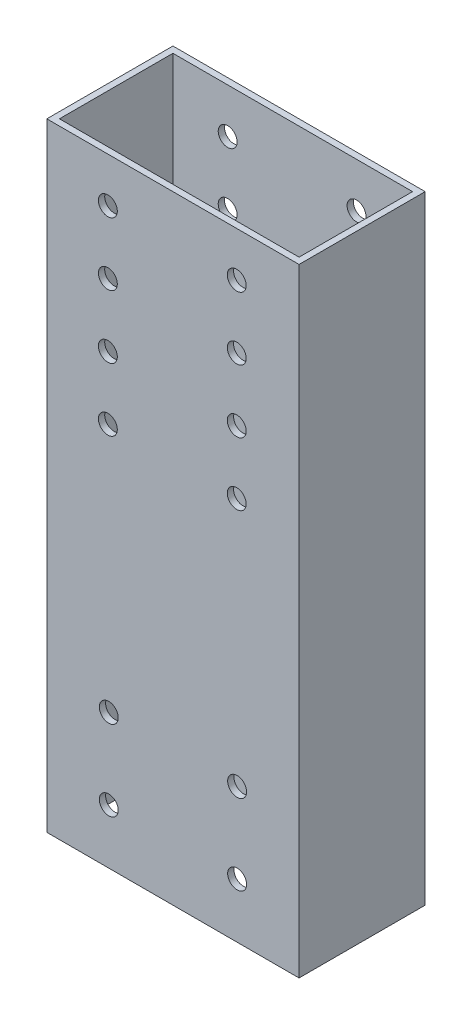
ISO-10303-21;
HEADER;
FILE_DESCRIPTION(('STEP AP214'),'2;1');
FILE_NAME('part.step','',(''),(''),'','','');
FILE_SCHEMA(('AUTOMOTIVE_DESIGN { 1 0 10303 214 1 1 1 1 }'));
ENDSEC;
DATA;
#1=APPLICATION_CONTEXT('core data for automotive mechanical design processes');
#2=APPLICATION_PROTOCOL_DEFINITION('international standard','automotive_design',2000,#1);
#3=PRODUCT_CONTEXT('',#1,'mechanical');
#4=PRODUCT('Part','Part','',(#3));
#5=PRODUCT_RELATED_PRODUCT_CATEGORY('part','',(#4));
#6=PRODUCT_DEFINITION_FORMATION('','',#4);
#7=PRODUCT_DEFINITION_CONTEXT('part definition',#1,'design');
#8=PRODUCT_DEFINITION('design','',#6,#7);
#9=PRODUCT_DEFINITION_SHAPE('','',#8);
#10=(LENGTH_UNIT() NAMED_UNIT(*) SI_UNIT(.MILLI.,.METRE.));
#11=(NAMED_UNIT(*) PLANE_ANGLE_UNIT() SI_UNIT($,.RADIAN.));
#12=(NAMED_UNIT(*) SI_UNIT($,.STERADIAN.) SOLID_ANGLE_UNIT());
#13=UNCERTAINTY_MEASURE_WITH_UNIT(LENGTH_MEASURE(1.E-05),#10,'distance_accuracy_value','');
#14=(GEOMETRIC_REPRESENTATION_CONTEXT(3) GLOBAL_UNCERTAINTY_ASSIGNED_CONTEXT((#13)) GLOBAL_UNIT_ASSIGNED_CONTEXT((#10,
#11,#12)) REPRESENTATION_CONTEXT('',''));
#15=CARTESIAN_POINT('',(0.,0.,0.));
#16=DIRECTION('',(0.,0.,1.));
#17=DIRECTION('',(1.,0.,0.));
#18=AXIS2_PLACEMENT_3D('',#15,#16,#17);
#19=CARTESIAN_POINT('',(0.,98.0000000000001,0.));
#20=DIRECTION('',(0.,-1.,0.));
#21=DIRECTION('',(0.,0.,-1.));
#22=AXIS2_PLACEMENT_3D('',#19,#20,#21);
#23=PLANE('',#22);
#24=DIRECTION('',(0.,0.,-1.));
#25=VECTOR('',#24,1.);
#26=CARTESIAN_POINT('',(20.,98.0000000000001,10.));
#27=LINE('',#26,#25);
#28=CARTESIAN_POINT('',(20.,98.0000000000001,10.));
#29=VERTEX_POINT('',#28);
#30=CARTESIAN_POINT('',(20.,98.0000000000001,-10.));
#31=VERTEX_POINT('',#30);
#32=EDGE_CURVE('E143',#29,#31,#27,.T.);
#33=ORIENTED_EDGE('',*,*,#32,.T.);
#34=DIRECTION('',(-1.,0.,0.));
#35=VECTOR('',#34,1.);
#36=CARTESIAN_POINT('',(-20.,98.0000000000001,-10.));
#37=LINE('',#36,#35);
#38=CARTESIAN_POINT('',(-20.,98.0000000000001,-10.));
#39=VERTEX_POINT('',#38);
#40=EDGE_CURVE('E146',#31,#39,#37,.T.);
#41=ORIENTED_EDGE('',*,*,#40,.T.);
#42=DIRECTION('',(0.,0.,1.));
#43=VECTOR('',#42,1.);
#44=CARTESIAN_POINT('',(-20.,98.0000000000001,10.));
#45=LINE('',#44,#43);
#46=CARTESIAN_POINT('',(-20.,98.0000000000001,10.));
#47=VERTEX_POINT('',#46);
#48=EDGE_CURVE('E149',#39,#47,#45,.T.);
#49=ORIENTED_EDGE('',*,*,#48,.T.);
#50=DIRECTION('',(1.,0.,0.));
#51=VECTOR('',#50,1.);
#52=CARTESIAN_POINT('',(-20.,98.0000000000001,10.));
#53=LINE('',#52,#51);
#54=EDGE_CURVE('E151',#47,#29,#53,.T.);
#55=ORIENTED_EDGE('',*,*,#54,.T.);
#56=EDGE_LOOP('',(#33,#41,#49,#55));
#57=FACE_BOUND('',#56,.T.);
#58=DIRECTION('',(0.,0.,-1.));
#59=VECTOR('',#58,1.);
#60=CARTESIAN_POINT('',(19.,98.0000000000001,0.));
#61=LINE('',#60,#59);
#62=CARTESIAN_POINT('',(19.,98.0000000000001,9.));
#63=VERTEX_POINT('',#62);
#64=CARTESIAN_POINT('',(19.,98.0000000000001,-9.));
#65=VERTEX_POINT('',#64);
#66=EDGE_CURVE('E131',#63,#65,#61,.T.);
#67=ORIENTED_EDGE('',*,*,#66,.F.);
#68=DIRECTION('',(1.,0.,0.));
#69=VECTOR('',#68,1.);
#70=CARTESIAN_POINT('',(0.,98.0000000000001,9.));
#71=LINE('',#70,#69);
#72=CARTESIAN_POINT('',(-19.,98.0000000000001,9.));
#73=VERTEX_POINT('',#72);
#74=EDGE_CURVE('E115',#73,#63,#71,.T.);
#75=ORIENTED_EDGE('',*,*,#74,.F.);
#76=DIRECTION('',(0.,0.,1.));
#77=VECTOR('',#76,1.);
#78=CARTESIAN_POINT('',(-19.,98.0000000000001,0.));
#79=LINE('',#78,#77);
#80=CARTESIAN_POINT('',(-19.,98.0000000000001,-9.));
#81=VERTEX_POINT('',#80);
#82=EDGE_CURVE('E140',#81,#73,#79,.T.);
#83=ORIENTED_EDGE('',*,*,#82,.F.);
#84=DIRECTION('',(-1.,0.,0.));
#85=VECTOR('',#84,1.);
#86=CARTESIAN_POINT('',(0.,98.0000000000001,-9.));
#87=LINE('',#86,#85);
#88=EDGE_CURVE('E133',#65,#81,#87,.T.);
#89=ORIENTED_EDGE('',*,*,#88,.F.);
#90=EDGE_LOOP('',(#67,#75,#83,#89));
#91=FACE_BOUND('',#90,.T.);
#92=ADVANCED_FACE('F43',(#57,#91),#23,.F.);
#93=CARTESIAN_POINT('',(0.,0.,0.));
#94=DIRECTION('',(0.,-1.,0.));
#95=DIRECTION('',(0.,0.,-1.));
#96=AXIS2_PLACEMENT_3D('',#93,#94,#95);
#97=PLANE('',#96);
#98=DIRECTION('',(0.,0.,-1.));
#99=VECTOR('',#98,1.);
#100=CARTESIAN_POINT('',(20.,0.,10.));
#101=LINE('',#100,#99);
#102=CARTESIAN_POINT('',(20.,0.,10.));
#103=VERTEX_POINT('',#102);
#104=CARTESIAN_POINT('',(20.,0.,-10.));
#105=VERTEX_POINT('',#104);
#106=EDGE_CURVE('E154',#103,#105,#101,.T.);
#107=ORIENTED_EDGE('',*,*,#106,.F.);
#108=DIRECTION('',(1.,0.,0.));
#109=VECTOR('',#108,1.);
#110=CARTESIAN_POINT('',(-20.,0.,10.));
#111=LINE('',#110,#109);
#112=CARTESIAN_POINT('',(-20.,0.,10.));
#113=VERTEX_POINT('',#112);
#114=EDGE_CURVE('E147',#113,#103,#111,.T.);
#115=ORIENTED_EDGE('',*,*,#114,.F.);
#116=DIRECTION('',(0.,0.,1.));
#117=VECTOR('',#116,1.);
#118=CARTESIAN_POINT('',(-20.,0.,10.));
#119=LINE('',#118,#117);
#120=CARTESIAN_POINT('',(-20.,0.,-10.));
#121=VERTEX_POINT('',#120);
#122=EDGE_CURVE('E159',#121,#113,#119,.T.);
#123=ORIENTED_EDGE('',*,*,#122,.F.);
#124=DIRECTION('',(-1.,0.,0.));
#125=VECTOR('',#124,1.);
#126=CARTESIAN_POINT('',(-20.,0.,-10.));
#127=LINE('',#126,#125);
#128=EDGE_CURVE('E157',#105,#121,#127,.T.);
#129=ORIENTED_EDGE('',*,*,#128,.F.);
#130=EDGE_LOOP('',(#107,#115,#123,#129));
#131=FACE_BOUND('',#130,.T.);
#132=DIRECTION('',(1.,0.,0.));
#133=VECTOR('',#132,1.);
#134=CARTESIAN_POINT('',(0.,0.,9.));
#135=LINE('',#134,#133);
#136=CARTESIAN_POINT('',(-19.,0.,9.));
#137=VERTEX_POINT('',#136);
#138=CARTESIAN_POINT('',(19.,0.,9.));
#139=VERTEX_POINT('',#138);
#140=EDGE_CURVE('E113',#137,#139,#135,.T.);
#141=ORIENTED_EDGE('',*,*,#140,.T.);
#142=DIRECTION('',(0.,0.,-1.));
#143=VECTOR('',#142,1.);
#144=CARTESIAN_POINT('',(19.,0.,0.));
#145=LINE('',#144,#143);
#146=CARTESIAN_POINT('',(19.,0.,-9.));
#147=VERTEX_POINT('',#146);
#148=EDGE_CURVE('E121',#139,#147,#145,.T.);
#149=ORIENTED_EDGE('',*,*,#148,.T.);
#150=DIRECTION('',(-1.,0.,0.));
#151=VECTOR('',#150,1.);
#152=CARTESIAN_POINT('',(0.,0.,-9.));
#153=LINE('',#152,#151);
#154=CARTESIAN_POINT('',(-19.,0.,-9.));
#155=VERTEX_POINT('',#154);
#156=EDGE_CURVE('E127',#147,#155,#153,.T.);
#157=ORIENTED_EDGE('',*,*,#156,.T.);
#158=DIRECTION('',(0.,0.,1.));
#159=VECTOR('',#158,1.);
#160=CARTESIAN_POINT('',(-19.,0.,0.));
#161=LINE('',#160,#159);
#162=EDGE_CURVE('E67',#155,#137,#161,.T.);
#163=ORIENTED_EDGE('',*,*,#162,.T.);
#164=EDGE_LOOP('',(#141,#149,#157,#163));
#165=FACE_BOUND('',#164,.T.);
#166=ADVANCED_FACE('F130',(#131,#165),#97,.T.);
#167=CARTESIAN_POINT('',(20.,98.0000000000001,10.));
#168=DIRECTION('',(-1.,0.,0.));
#169=DIRECTION('',(0.,0.,1.));
#170=AXIS2_PLACEMENT_3D('',#167,#168,#169);
#171=PLANE('',#170);
#172=ORIENTED_EDGE('',*,*,#106,.T.);
#173=DIRECTION('',(0.,-1.,0.));
#174=VECTOR('',#173,1.);
#175=CARTESIAN_POINT('',(20.,98.0000000000001,-10.));
#176=LINE('',#175,#174);
#177=EDGE_CURVE('E11',#31,#105,#176,.T.);
#178=ORIENTED_EDGE('',*,*,#177,.F.);
#179=ORIENTED_EDGE('',*,*,#32,.F.);
#180=DIRECTION('',(0.,-1.,0.));
#181=VECTOR('',#180,1.);
#182=CARTESIAN_POINT('',(20.,98.0000000000001,10.));
#183=LINE('',#182,#181);
#184=EDGE_CURVE('E153',#29,#103,#183,.T.);
#185=ORIENTED_EDGE('',*,*,#184,.T.);
#186=EDGE_LOOP('',(#172,#178,#179,#185));
#187=FACE_BOUND('',#186,.T.);
#188=ADVANCED_FACE('F45',(#187),#171,.F.);
#189=CARTESIAN_POINT('',(-20.,98.0000000000001,-10.));
#190=DIRECTION('',(0.,0.,1.));
#191=DIRECTION('',(1.,0.,0.));
#192=AXIS2_PLACEMENT_3D('',#189,#190,#191);
#193=PLANE('',#192);
#194=CARTESIAN_POINT('',(10.116242575959,60.8998336255279,-10.));
#195=DIRECTION('',(0.,0.,-1.));
#196=DIRECTION('',(-1.,0.,0.));
#197=AXIS2_PLACEMENT_3D('',#194,#195,#196);
#198=CIRCLE('',#197,1.5);
#199=CARTESIAN_POINT('',(8.61624257595895,60.8998336255279,-10.));
#200=VERTEX_POINT('',#199);
#201=EDGE_CURVE('E318',#200,#200,#198,.T.);
#202=ORIENTED_EDGE('',*,*,#201,.F.);
#203=EDGE_LOOP('',(#202));
#204=FACE_BOUND('',#203,.T.);
#205=CARTESIAN_POINT('',(10.116242575959,70.8998336255278,-10.));
#206=DIRECTION('',(0.,0.,-1.));
#207=DIRECTION('',(-1.,0.,0.));
#208=AXIS2_PLACEMENT_3D('',#205,#206,#207);
#209=CIRCLE('',#208,1.5);
#210=CARTESIAN_POINT('',(8.61624257595895,70.8998336255278,-10.));
#211=VERTEX_POINT('',#210);
#212=EDGE_CURVE('E322',#211,#211,#209,.T.);
#213=ORIENTED_EDGE('',*,*,#212,.F.);
#214=EDGE_LOOP('',(#213));
#215=FACE_BOUND('',#214,.T.);
#216=CARTESIAN_POINT('',(-10.3212201594344,70.8998336255278,-10.));
#217=DIRECTION('',(0.,0.,-1.));
#218=DIRECTION('',(-1.,0.,0.));
#219=AXIS2_PLACEMENT_3D('',#216,#217,#218);
#220=CIRCLE('',#219,1.50000000000001);
#221=CARTESIAN_POINT('',(-11.8212201594344,70.8998336255278,-10.));
#222=VERTEX_POINT('',#221);
#223=EDGE_CURVE('E326',#222,#222,#220,.T.);
#224=ORIENTED_EDGE('',*,*,#223,.F.);
#225=EDGE_LOOP('',(#224));
#226=FACE_BOUND('',#225,.T.);
#227=CARTESIAN_POINT('',(-10.3212201594344,80.8998336255279,-10.));
#228=DIRECTION('',(0.,0.,-1.));
#229=DIRECTION('',(-1.,0.,0.));
#230=AXIS2_PLACEMENT_3D('',#227,#228,#229);
#231=CIRCLE('',#230,1.50000000000001);
#232=CARTESIAN_POINT('',(-11.8212201594344,80.8998336255279,-10.));
#233=VERTEX_POINT('',#232);
#234=EDGE_CURVE('E330',#233,#233,#231,.T.);
#235=ORIENTED_EDGE('',*,*,#234,.F.);
#236=EDGE_LOOP('',(#235));
#237=FACE_BOUND('',#236,.T.);
#238=CARTESIAN_POINT('',(10.116242575959,90.8998336255278,-10.));
#239=DIRECTION('',(0.,0.,-1.));
#240=DIRECTION('',(-1.,0.,0.));
#241=AXIS2_PLACEMENT_3D('',#238,#239,#240);
#242=CIRCLE('',#241,1.5);
#243=CARTESIAN_POINT('',(8.61624257595895,90.8998336255278,-10.));
#244=VERTEX_POINT('',#243);
#245=EDGE_CURVE('E334',#244,#244,#242,.T.);
#246=ORIENTED_EDGE('',*,*,#245,.F.);
#247=EDGE_LOOP('',(#246));
#248=FACE_BOUND('',#247,.T.);
#249=CARTESIAN_POINT('',(-10.3212201594344,90.8998336255278,-10.));
#250=DIRECTION('',(0.,0.,-1.));
#251=DIRECTION('',(-1.,0.,0.));
#252=AXIS2_PLACEMENT_3D('',#249,#250,#251);
#253=CIRCLE('',#252,1.50000000000001);
#254=CARTESIAN_POINT('',(-11.8212201594344,90.8998336255278,-10.));
#255=VERTEX_POINT('',#254);
#256=EDGE_CURVE('E338',#255,#255,#253,.T.);
#257=ORIENTED_EDGE('',*,*,#256,.F.);
#258=EDGE_LOOP('',(#257));
#259=FACE_BOUND('',#258,.T.);
#260=CARTESIAN_POINT('',(10.116242575959,80.8998336255279,-10.));
#261=DIRECTION('',(0.,0.,-1.));
#262=DIRECTION('',(-1.,0.,0.));
#263=AXIS2_PLACEMENT_3D('',#260,#261,#262);
#264=CIRCLE('',#263,1.5);
#265=CARTESIAN_POINT('',(8.61624257595895,80.8998336255279,-10.));
#266=VERTEX_POINT('',#265);
#267=EDGE_CURVE('E342',#266,#266,#264,.T.);
#268=ORIENTED_EDGE('',*,*,#267,.F.);
#269=EDGE_LOOP('',(#268));
#270=FACE_BOUND('',#269,.T.);
#271=CARTESIAN_POINT('',(-10.3212201594344,60.8998336255279,-10.));
#272=DIRECTION('',(0.,0.,-1.));
#273=DIRECTION('',(-1.,0.,0.));
#274=AXIS2_PLACEMENT_3D('',#271,#272,#273);
#275=CIRCLE('',#274,1.50000000000001);
#276=CARTESIAN_POINT('',(-11.8212201594344,60.8998336255279,-10.));
#277=VERTEX_POINT('',#276);
#278=EDGE_CURVE('E193',#277,#277,#275,.T.);
#279=ORIENTED_EDGE('',*,*,#278,.F.);
#280=EDGE_LOOP('',(#279));
#281=FACE_BOUND('',#280,.T.);
#282=CARTESIAN_POINT('',(-10.1800493860339,8.6875829168602,-10.));
#283=DIRECTION('',(0.,0.,-1.));
#284=DIRECTION('',(1.,0.,0.));
#285=AXIS2_PLACEMENT_3D('',#282,#283,#284);
#286=CIRCLE('',#285,1.5);
#287=CARTESIAN_POINT('',(-8.68004938603394,8.6875829168602,-10.));
#288=VERTEX_POINT('',#287);
#289=EDGE_CURVE('E243',#288,#288,#286,.T.);
#290=ORIENTED_EDGE('',*,*,#289,.F.);
#291=EDGE_LOOP('',(#290));
#292=FACE_BOUND('',#291,.T.);
#293=CARTESIAN_POINT('',(-10.1800493860339,21.401128756432,-10.));
#294=DIRECTION('',(0.,0.,-1.));
#295=DIRECTION('',(1.,0.,0.));
#296=AXIS2_PLACEMENT_3D('',#293,#294,#295);
#297=CIRCLE('',#296,1.5);
#298=CARTESIAN_POINT('',(-8.68004938603394,21.401128756432,-10.));
#299=VERTEX_POINT('',#298);
#300=EDGE_CURVE('E247',#299,#299,#297,.T.);
#301=ORIENTED_EDGE('',*,*,#300,.F.);
#302=EDGE_LOOP('',(#301));
#303=FACE_BOUND('',#302,.T.);
#304=CARTESIAN_POINT('',(10.1800493860339,21.401128756432,-10.));
#305=DIRECTION('',(0.,0.,-1.));
#306=DIRECTION('',(-1.,0.,0.));
#307=AXIS2_PLACEMENT_3D('',#304,#305,#306);
#308=CIRCLE('',#307,1.5);
#309=CARTESIAN_POINT('',(8.68004938603394,21.401128756432,-10.));
#310=VERTEX_POINT('',#309);
#311=EDGE_CURVE('E244',#310,#310,#308,.T.);
#312=ORIENTED_EDGE('',*,*,#311,.F.);
#313=EDGE_LOOP('',(#312));
#314=FACE_BOUND('',#313,.T.);
#315=CARTESIAN_POINT('',(10.1800493860339,8.6875829168602,-10.));
#316=DIRECTION('',(0.,0.,-1.));
#317=DIRECTION('',(-1.,0.,0.));
#318=AXIS2_PLACEMENT_3D('',#315,#316,#317);
#319=CIRCLE('',#318,1.5);
#320=CARTESIAN_POINT('',(8.68004938603394,8.6875829168602,-10.));
#321=VERTEX_POINT('',#320);
#322=EDGE_CURVE('E173',#321,#321,#319,.T.);
#323=ORIENTED_EDGE('',*,*,#322,.F.);
#324=EDGE_LOOP('',(#323));
#325=FACE_BOUND('',#324,.T.);
#326=ORIENTED_EDGE('',*,*,#128,.T.);
#327=DIRECTION('',(0.,-1.,0.));
#328=VECTOR('',#327,1.);
#329=CARTESIAN_POINT('',(-20.,98.0000000000001,-10.));
#330=LINE('',#329,#328);
#331=EDGE_CURVE('E52',#39,#121,#330,.T.);
#332=ORIENTED_EDGE('',*,*,#331,.F.);
#333=ORIENTED_EDGE('',*,*,#40,.F.);
#334=ORIENTED_EDGE('',*,*,#177,.T.);
#335=EDGE_LOOP('',(#326,#332,#333,#334));
#336=FACE_BOUND('',#335,.T.);
#337=ADVANCED_FACE('F306',(#204,#215,#226,#237,#248,#259,#270,#281,#292,#303,#314,#325,#336),
#193,.F.);
#338=CARTESIAN_POINT('',(-20.,98.0000000000001,10.));
#339=DIRECTION('',(1.,0.,0.));
#340=DIRECTION('',(0.,0.,-1.));
#341=AXIS2_PLACEMENT_3D('',#338,#339,#340);
#342=PLANE('',#341);
#343=ORIENTED_EDGE('',*,*,#122,.T.);
#344=DIRECTION('',(0.,-1.,0.));
#345=VECTOR('',#344,1.);
#346=CARTESIAN_POINT('',(-20.,98.0000000000001,10.));
#347=LINE('',#346,#345);
#348=EDGE_CURVE('E164',#47,#113,#347,.T.);
#349=ORIENTED_EDGE('',*,*,#348,.F.);
#350=ORIENTED_EDGE('',*,*,#48,.F.);
#351=ORIENTED_EDGE('',*,*,#331,.T.);
#352=EDGE_LOOP('',(#343,#349,#350,#351));
#353=FACE_BOUND('',#352,.T.);
#354=ADVANCED_FACE('F304',(#353),#342,.F.);
#355=CARTESIAN_POINT('',(-20.,98.0000000000001,10.));
#356=DIRECTION('',(0.,0.,-1.));
#357=DIRECTION('',(-1.,0.,0.));
#358=AXIS2_PLACEMENT_3D('',#355,#356,#357);
#359=PLANE('',#358);
#360=CARTESIAN_POINT('',(10.116242575959,60.8998336255279,10.));
#361=DIRECTION('',(0.,0.,-1.));
#362=DIRECTION('',(-1.,0.,0.));
#363=AXIS2_PLACEMENT_3D('',#360,#361,#362);
#364=CIRCLE('',#363,1.5);
#365=CARTESIAN_POINT('',(8.61624257595895,60.8998336255279,10.));
#366=VERTEX_POINT('',#365);
#367=EDGE_CURVE('E240',#366,#366,#364,.T.);
#368=ORIENTED_EDGE('',*,*,#367,.T.);
#369=EDGE_LOOP('',(#368));
#370=FACE_BOUND('',#369,.T.);
#371=CARTESIAN_POINT('',(10.116242575959,70.8998336255278,10.));
#372=DIRECTION('',(0.,0.,-1.));
#373=DIRECTION('',(-1.,0.,0.));
#374=AXIS2_PLACEMENT_3D('',#371,#372,#373);
#375=CIRCLE('',#374,1.5);
#376=CARTESIAN_POINT('',(8.61624257595895,70.8998336255278,10.));
#377=VERTEX_POINT('',#376);
#378=EDGE_CURVE('E225',#377,#377,#375,.T.);
#379=ORIENTED_EDGE('',*,*,#378,.T.);
#380=EDGE_LOOP('',(#379));
#381=FACE_BOUND('',#380,.T.);
#382=CARTESIAN_POINT('',(-10.3212201594344,70.8998336255278,10.));
#383=DIRECTION('',(0.,0.,-1.));
#384=DIRECTION('',(-1.,0.,0.));
#385=AXIS2_PLACEMENT_3D('',#382,#383,#384);
#386=CIRCLE('',#385,1.50000000000001);
#387=CARTESIAN_POINT('',(-11.8212201594344,70.8998336255278,10.));
#388=VERTEX_POINT('',#387);
#389=EDGE_CURVE('E221',#388,#388,#386,.T.);
#390=ORIENTED_EDGE('',*,*,#389,.T.);
#391=EDGE_LOOP('',(#390));
#392=FACE_BOUND('',#391,.T.);
#393=CARTESIAN_POINT('',(-10.3212201594344,80.8998336255279,10.));
#394=DIRECTION('',(0.,0.,-1.));
#395=DIRECTION('',(-1.,0.,0.));
#396=AXIS2_PLACEMENT_3D('',#393,#394,#395);
#397=CIRCLE('',#396,1.50000000000001);
#398=CARTESIAN_POINT('',(-11.8212201594344,80.8998336255279,10.));
#399=VERTEX_POINT('',#398);
#400=EDGE_CURVE('E217',#399,#399,#397,.T.);
#401=ORIENTED_EDGE('',*,*,#400,.T.);
#402=EDGE_LOOP('',(#401));
#403=FACE_BOUND('',#402,.T.);
#404=CARTESIAN_POINT('',(10.116242575959,90.8998336255278,10.));
#405=DIRECTION('',(0.,0.,-1.));
#406=DIRECTION('',(-1.,0.,0.));
#407=AXIS2_PLACEMENT_3D('',#404,#405,#406);
#408=CIRCLE('',#407,1.5);
#409=CARTESIAN_POINT('',(8.61624257595895,90.8998336255278,10.));
#410=VERTEX_POINT('',#409);
#411=EDGE_CURVE('E213',#410,#410,#408,.T.);
#412=ORIENTED_EDGE('',*,*,#411,.T.);
#413=EDGE_LOOP('',(#412));
#414=FACE_BOUND('',#413,.T.);
#415=CARTESIAN_POINT('',(-10.3212201594344,90.8998336255278,10.));
#416=DIRECTION('',(0.,0.,-1.));
#417=DIRECTION('',(-1.,0.,0.));
#418=AXIS2_PLACEMENT_3D('',#415,#416,#417);
#419=CIRCLE('',#418,1.50000000000001);
#420=CARTESIAN_POINT('',(-11.8212201594344,90.8998336255278,10.));
#421=VERTEX_POINT('',#420);
#422=EDGE_CURVE('E208',#421,#421,#419,.T.);
#423=ORIENTED_EDGE('',*,*,#422,.T.);
#424=EDGE_LOOP('',(#423));
#425=FACE_BOUND('',#424,.T.);
#426=CARTESIAN_POINT('',(10.116242575959,80.8998336255279,10.));
#427=DIRECTION('',(0.,0.,-1.));
#428=DIRECTION('',(-1.,0.,0.));
#429=AXIS2_PLACEMENT_3D('',#426,#427,#428);
#430=CIRCLE('',#429,1.5);
#431=CARTESIAN_POINT('',(8.61624257595895,80.8998336255279,10.));
#432=VERTEX_POINT('',#431);
#433=EDGE_CURVE('E203',#432,#432,#430,.T.);
#434=ORIENTED_EDGE('',*,*,#433,.T.);
#435=EDGE_LOOP('',(#434));
#436=FACE_BOUND('',#435,.T.);
#437=CARTESIAN_POINT('',(-10.3212201594344,60.8998336255279,10.));
#438=DIRECTION('',(0.,0.,-1.));
#439=DIRECTION('',(-1.,0.,0.));
#440=AXIS2_PLACEMENT_3D('',#437,#438,#439);
#441=CIRCLE('',#440,1.50000000000001);
#442=CARTESIAN_POINT('',(-11.8212201594344,60.8998336255279,10.));
#443=VERTEX_POINT('',#442);
#444=EDGE_CURVE('E198',#443,#443,#441,.T.);
#445=ORIENTED_EDGE('',*,*,#444,.T.);
#446=EDGE_LOOP('',(#445));
#447=FACE_BOUND('',#446,.T.);
#448=CARTESIAN_POINT('',(-10.1800493860339,8.6875829168602,10.));
#449=DIRECTION('',(0.,0.,-1.));
#450=DIRECTION('',(-1.,0.,0.));
#451=AXIS2_PLACEMENT_3D('',#448,#449,#450);
#452=CIRCLE('',#451,1.5);
#453=CARTESIAN_POINT('',(-11.6800493860339,8.6875829168602,10.));
#454=VERTEX_POINT('',#453);
#455=EDGE_CURVE('E128',#454,#454,#452,.T.);
#456=ORIENTED_EDGE('',*,*,#455,.T.);
#457=EDGE_LOOP('',(#456));
#458=FACE_BOUND('',#457,.T.);
#459=CARTESIAN_POINT('',(-10.1800493860339,21.401128756432,10.));
#460=DIRECTION('',(0.,0.,-1.));
#461=DIRECTION('',(-1.,0.,0.));
#462=AXIS2_PLACEMENT_3D('',#459,#460,#461);
#463=CIRCLE('',#462,1.5);
#464=CARTESIAN_POINT('',(-11.6800493860339,21.401128756432,10.));
#465=VERTEX_POINT('',#464);
#466=EDGE_CURVE('E188',#465,#465,#463,.T.);
#467=ORIENTED_EDGE('',*,*,#466,.T.);
#468=EDGE_LOOP('',(#467));
#469=FACE_BOUND('',#468,.T.);
#470=CARTESIAN_POINT('',(10.1800493860339,21.401128756432,10.));
#471=DIRECTION('',(0.,0.,-1.));
#472=DIRECTION('',(-1.,0.,0.));
#473=AXIS2_PLACEMENT_3D('',#470,#471,#472);
#474=CIRCLE('',#473,1.5);
#475=CARTESIAN_POINT('',(8.68004938603394,21.401128756432,10.));
#476=VERTEX_POINT('',#475);
#477=EDGE_CURVE('E183',#476,#476,#474,.T.);
#478=ORIENTED_EDGE('',*,*,#477,.T.);
#479=EDGE_LOOP('',(#478));
#480=FACE_BOUND('',#479,.T.);
#481=CARTESIAN_POINT('',(10.1800493860339,8.6875829168602,10.));
#482=DIRECTION('',(0.,0.,-1.));
#483=DIRECTION('',(-1.,0.,0.));
#484=AXIS2_PLACEMENT_3D('',#481,#482,#483);
#485=CIRCLE('',#484,1.5);
#486=CARTESIAN_POINT('',(8.68004938603394,8.6875829168602,10.));
#487=VERTEX_POINT('',#486);
#488=EDGE_CURVE('E178',#487,#487,#485,.T.);
#489=ORIENTED_EDGE('',*,*,#488,.T.);
#490=EDGE_LOOP('',(#489));
#491=FACE_BOUND('',#490,.T.);
#492=ORIENTED_EDGE('',*,*,#114,.T.);
#493=ORIENTED_EDGE('',*,*,#184,.F.);
#494=ORIENTED_EDGE('',*,*,#54,.F.);
#495=ORIENTED_EDGE('',*,*,#348,.T.);
#496=EDGE_LOOP('',(#492,#493,#494,#495));
#497=FACE_BOUND('',#496,.T.);
#498=ADVANCED_FACE('F288',(#370,#381,#392,#403,#414,#425,#436,#447,#458,#469,#480,#491,#497),
#359,.F.);
#499=CARTESIAN_POINT('',(19.,98.0000000000001,10.));
#500=DIRECTION('',(-1.,0.,0.));
#501=DIRECTION('',(0.,0.,1.));
#502=AXIS2_PLACEMENT_3D('',#499,#500,#501);
#503=PLANE('',#502);
#504=ORIENTED_EDGE('',*,*,#148,.F.);
#505=DIRECTION('',(0.,-1.,0.));
#506=VECTOR('',#505,1.);
#507=CARTESIAN_POINT('',(19.,98.0000000000001,9.));
#508=LINE('',#507,#506);
#509=EDGE_CURVE('E109',#63,#139,#508,.T.);
#510=ORIENTED_EDGE('',*,*,#509,.F.);
#511=ORIENTED_EDGE('',*,*,#66,.T.);
#512=DIRECTION('',(0.,-1.,0.));
#513=VECTOR('',#512,1.);
#514=CARTESIAN_POINT('',(19.,98.0000000000001,-9.));
#515=LINE('',#514,#513);
#516=EDGE_CURVE('E124',#65,#147,#515,.T.);
#517=ORIENTED_EDGE('',*,*,#516,.T.);
#518=EDGE_LOOP('',(#504,#510,#511,#517));
#519=FACE_BOUND('',#518,.T.);
#520=ADVANCED_FACE('F122',(#519),#503,.T.);
#521=CARTESIAN_POINT('',(-20.,98.0000000000001,-9.));
#522=DIRECTION('',(0.,0.,1.));
#523=DIRECTION('',(1.,0.,0.));
#524=AXIS2_PLACEMENT_3D('',#521,#522,#523);
#525=PLANE('',#524);
#526=CARTESIAN_POINT('',(10.116242575959,60.8998336255279,-8.99999999999999));
#527=DIRECTION('',(0.,0.,1.));
#528=DIRECTION('',(1.,0.,0.));
#529=AXIS2_PLACEMENT_3D('',#526,#527,#528);
#530=CIRCLE('',#529,1.5);
#531=CARTESIAN_POINT('',(11.616242575959,60.8998336255279,-8.99999999999999));
#532=VERTEX_POINT('',#531);
#533=EDGE_CURVE('E237',#532,#532,#530,.T.);
#534=ORIENTED_EDGE('',*,*,#533,.F.);
#535=EDGE_LOOP('',(#534));
#536=FACE_BOUND('',#535,.T.);
#537=CARTESIAN_POINT('',(10.116242575959,70.8998336255278,-8.99999999999999));
#538=DIRECTION('',(0.,0.,1.));
#539=DIRECTION('',(1.,0.,0.));
#540=AXIS2_PLACEMENT_3D('',#537,#538,#539);
#541=CIRCLE('',#540,1.5);
#542=CARTESIAN_POINT('',(11.616242575959,70.8998336255278,-8.99999999999999));
#543=VERTEX_POINT('',#542);
#544=EDGE_CURVE('E220',#543,#543,#541,.T.);
#545=ORIENTED_EDGE('',*,*,#544,.F.);
#546=EDGE_LOOP('',(#545));
#547=FACE_BOUND('',#546,.T.);
#548=CARTESIAN_POINT('',(-10.3212201594344,70.8998336255278,-8.99999999999999));
#549=DIRECTION('',(0.,0.,1.));
#550=DIRECTION('',(1.,0.,0.));
#551=AXIS2_PLACEMENT_3D('',#548,#549,#550);
#552=CIRCLE('',#551,1.50000000000001);
#553=CARTESIAN_POINT('',(-8.82122015943437,70.8998336255278,-8.99999999999999));
#554=VERTEX_POINT('',#553);
#555=EDGE_CURVE('E216',#554,#554,#552,.T.);
#556=ORIENTED_EDGE('',*,*,#555,.F.);
#557=EDGE_LOOP('',(#556));
#558=FACE_BOUND('',#557,.T.);
#559=CARTESIAN_POINT('',(-10.3212201594344,80.8998336255279,-8.99999999999999));
#560=DIRECTION('',(0.,0.,1.));
#561=DIRECTION('',(1.,0.,0.));
#562=AXIS2_PLACEMENT_3D('',#559,#560,#561);
#563=CIRCLE('',#562,1.50000000000001);
#564=CARTESIAN_POINT('',(-8.82122015943437,80.8998336255279,-8.99999999999999));
#565=VERTEX_POINT('',#564);
#566=EDGE_CURVE('E212',#565,#565,#563,.T.);
#567=ORIENTED_EDGE('',*,*,#566,.F.);
#568=EDGE_LOOP('',(#567));
#569=FACE_BOUND('',#568,.T.);
#570=CARTESIAN_POINT('',(10.116242575959,90.8998336255278,-8.99999999999999));
#571=DIRECTION('',(0.,0.,1.));
#572=DIRECTION('',(1.,0.,0.));
#573=AXIS2_PLACEMENT_3D('',#570,#571,#572);
#574=CIRCLE('',#573,1.5);
#575=CARTESIAN_POINT('',(11.616242575959,90.8998336255278,-8.99999999999999));
#576=VERTEX_POINT('',#575);
#577=EDGE_CURVE('E207',#576,#576,#574,.T.);
#578=ORIENTED_EDGE('',*,*,#577,.F.);
#579=EDGE_LOOP('',(#578));
#580=FACE_BOUND('',#579,.T.);
#581=CARTESIAN_POINT('',(-10.3212201594344,90.8998336255278,-8.99999999999999));
#582=DIRECTION('',(0.,0.,1.));
#583=DIRECTION('',(1.,0.,0.));
#584=AXIS2_PLACEMENT_3D('',#581,#582,#583);
#585=CIRCLE('',#584,1.50000000000001);
#586=CARTESIAN_POINT('',(-8.82122015943437,90.8998336255278,-8.99999999999999));
#587=VERTEX_POINT('',#586);
#588=EDGE_CURVE('E202',#587,#587,#585,.T.);
#589=ORIENTED_EDGE('',*,*,#588,.F.);
#590=EDGE_LOOP('',(#589));
#591=FACE_BOUND('',#590,.T.);
#592=CARTESIAN_POINT('',(10.116242575959,80.8998336255279,-8.99999999999999));
#593=DIRECTION('',(0.,0.,1.));
#594=DIRECTION('',(1.,0.,0.));
#595=AXIS2_PLACEMENT_3D('',#592,#593,#594);
#596=CIRCLE('',#595,1.5);
#597=CARTESIAN_POINT('',(11.616242575959,80.8998336255279,-8.99999999999999));
#598=VERTEX_POINT('',#597);
#599=EDGE_CURVE('E197',#598,#598,#596,.T.);
#600=ORIENTED_EDGE('',*,*,#599,.F.);
#601=EDGE_LOOP('',(#600));
#602=FACE_BOUND('',#601,.T.);
#603=CARTESIAN_POINT('',(-10.3212201594344,60.8998336255279,-8.99999999999999));
#604=DIRECTION('',(0.,0.,1.));
#605=DIRECTION('',(1.,0.,0.));
#606=AXIS2_PLACEMENT_3D('',#603,#604,#605);
#607=CIRCLE('',#606,1.50000000000001);
#608=CARTESIAN_POINT('',(-8.82122015943437,60.8998336255279,-8.99999999999999));
#609=VERTEX_POINT('',#608);
#610=EDGE_CURVE('E192',#609,#609,#607,.T.);
#611=ORIENTED_EDGE('',*,*,#610,.F.);
#612=EDGE_LOOP('',(#611));
#613=FACE_BOUND('',#612,.T.);
#614=CARTESIAN_POINT('',(-10.1800493860339,8.6875829168602,-9.));
#615=DIRECTION('',(0.,0.,1.));
#616=DIRECTION('',(1.,0.,0.));
#617=AXIS2_PLACEMENT_3D('',#614,#615,#616);
#618=CIRCLE('',#617,1.5);
#619=CARTESIAN_POINT('',(-8.68004938603394,8.6875829168602,-9.));
#620=VERTEX_POINT('',#619);
#621=EDGE_CURVE('E187',#620,#620,#618,.T.);
#622=ORIENTED_EDGE('',*,*,#621,.F.);
#623=EDGE_LOOP('',(#622));
#624=FACE_BOUND('',#623,.T.);
#625=CARTESIAN_POINT('',(-10.1800493860339,21.401128756432,-9.));
#626=DIRECTION('',(0.,0.,1.));
#627=DIRECTION('',(1.,0.,0.));
#628=AXIS2_PLACEMENT_3D('',#625,#626,#627);
#629=CIRCLE('',#628,1.5);
#630=CARTESIAN_POINT('',(-8.68004938603394,21.401128756432,-9.));
#631=VERTEX_POINT('',#630);
#632=EDGE_CURVE('E182',#631,#631,#629,.T.);
#633=ORIENTED_EDGE('',*,*,#632,.F.);
#634=EDGE_LOOP('',(#633));
#635=FACE_BOUND('',#634,.T.);
#636=CARTESIAN_POINT('',(10.1800493860339,21.401128756432,-9.));
#637=DIRECTION('',(0.,0.,1.));
#638=DIRECTION('',(1.,0.,0.));
#639=AXIS2_PLACEMENT_3D('',#636,#637,#638);
#640=CIRCLE('',#639,1.5);
#641=CARTESIAN_POINT('',(11.6800493860339,21.401128756432,-9.));
#642=VERTEX_POINT('',#641);
#643=EDGE_CURVE('E177',#642,#642,#640,.T.);
#644=ORIENTED_EDGE('',*,*,#643,.F.);
#645=EDGE_LOOP('',(#644));
#646=FACE_BOUND('',#645,.T.);
#647=CARTESIAN_POINT('',(10.1800493860339,8.6875829168602,-9.));
#648=DIRECTION('',(0.,0.,1.));
#649=DIRECTION('',(1.,0.,0.));
#650=AXIS2_PLACEMENT_3D('',#647,#648,#649);
#651=CIRCLE('',#650,1.5);
#652=CARTESIAN_POINT('',(11.6800493860339,8.6875829168602,-9.));
#653=VERTEX_POINT('',#652);
#654=EDGE_CURVE('E172',#653,#653,#651,.T.);
#655=ORIENTED_EDGE('',*,*,#654,.F.);
#656=EDGE_LOOP('',(#655));
#657=FACE_BOUND('',#656,.T.);
#658=ORIENTED_EDGE('',*,*,#156,.F.);
#659=ORIENTED_EDGE('',*,*,#516,.F.);
#660=ORIENTED_EDGE('',*,*,#88,.T.);
#661=DIRECTION('',(0.,-1.,0.));
#662=VECTOR('',#661,1.);
#663=CARTESIAN_POINT('',(-19.,98.0000000000001,-9.));
#664=LINE('',#663,#662);
#665=EDGE_CURVE('E270',#81,#155,#664,.T.);
#666=ORIENTED_EDGE('',*,*,#665,.T.);
#667=EDGE_LOOP('',(#658,#659,#660,#666));
#668=FACE_BOUND('',#667,.T.);
#669=ADVANCED_FACE('F277',(#536,#547,#558,#569,#580,#591,#602,#613,#624,#635,#646,#657,#668),
#525,.T.);
#670=CARTESIAN_POINT('',(-19.,98.0000000000001,10.));
#671=DIRECTION('',(1.,0.,0.));
#672=DIRECTION('',(0.,0.,-1.));
#673=AXIS2_PLACEMENT_3D('',#670,#671,#672);
#674=PLANE('',#673);
#675=ORIENTED_EDGE('',*,*,#162,.F.);
#676=ORIENTED_EDGE('',*,*,#665,.F.);
#677=ORIENTED_EDGE('',*,*,#82,.T.);
#678=DIRECTION('',(0.,-1.,0.));
#679=VECTOR('',#678,1.);
#680=CARTESIAN_POINT('',(-19.,98.0000000000001,9.));
#681=LINE('',#680,#679);
#682=EDGE_CURVE('E60',#73,#137,#681,.T.);
#683=ORIENTED_EDGE('',*,*,#682,.T.);
#684=EDGE_LOOP('',(#675,#676,#677,#683));
#685=FACE_BOUND('',#684,.T.);
#686=ADVANCED_FACE('F272',(#685),#674,.T.);
#687=CARTESIAN_POINT('',(-20.,98.0000000000001,9.));
#688=DIRECTION('',(0.,0.,-1.));
#689=DIRECTION('',(-1.,0.,0.));
#690=AXIS2_PLACEMENT_3D('',#687,#688,#689);
#691=PLANE('',#690);
#692=CARTESIAN_POINT('',(10.116242575959,60.8998336255279,9.));
#693=DIRECTION('',(0.,0.,-1.));
#694=DIRECTION('',(-1.,0.,0.));
#695=AXIS2_PLACEMENT_3D('',#692,#693,#694);
#696=CIRCLE('',#695,1.5);
#697=CARTESIAN_POINT('',(8.61624257595895,60.8998336255279,9.));
#698=VERTEX_POINT('',#697);
#699=EDGE_CURVE('E47',#698,#698,#696,.T.);
#700=ORIENTED_EDGE('',*,*,#699,.F.);
#701=EDGE_LOOP('',(#700));
#702=FACE_BOUND('',#701,.T.);
#703=CARTESIAN_POINT('',(10.116242575959,70.8998336255278,9.));
#704=DIRECTION('',(0.,0.,-1.));
#705=DIRECTION('',(-1.,0.,0.));
#706=AXIS2_PLACEMENT_3D('',#703,#704,#705);
#707=CIRCLE('',#706,1.5);
#708=CARTESIAN_POINT('',(8.61624257595895,70.8998336255278,9.));
#709=VERTEX_POINT('',#708);
#710=EDGE_CURVE('E218',#709,#709,#707,.T.);
#711=ORIENTED_EDGE('',*,*,#710,.F.);
#712=EDGE_LOOP('',(#711));
#713=FACE_BOUND('',#712,.T.);
#714=CARTESIAN_POINT('',(-10.3212201594344,70.8998336255278,9.));
#715=DIRECTION('',(0.,0.,-1.));
#716=DIRECTION('',(-1.,0.,0.));
#717=AXIS2_PLACEMENT_3D('',#714,#715,#716);
#718=CIRCLE('',#717,1.50000000000001);
#719=CARTESIAN_POINT('',(-11.8212201594344,70.8998336255278,9.));
#720=VERTEX_POINT('',#719);
#721=EDGE_CURVE('E214',#720,#720,#718,.T.);
#722=ORIENTED_EDGE('',*,*,#721,.F.);
#723=EDGE_LOOP('',(#722));
#724=FACE_BOUND('',#723,.T.);
#725=CARTESIAN_POINT('',(-10.3212201594344,80.8998336255279,9.));
#726=DIRECTION('',(0.,0.,-1.));
#727=DIRECTION('',(-1.,0.,0.));
#728=AXIS2_PLACEMENT_3D('',#725,#726,#727);
#729=CIRCLE('',#728,1.50000000000001);
#730=CARTESIAN_POINT('',(-11.8212201594344,80.8998336255279,9.));
#731=VERTEX_POINT('',#730);
#732=EDGE_CURVE('E209',#731,#731,#729,.T.);
#733=ORIENTED_EDGE('',*,*,#732,.F.);
#734=EDGE_LOOP('',(#733));
#735=FACE_BOUND('',#734,.T.);
#736=CARTESIAN_POINT('',(10.116242575959,90.8998336255278,9.));
#737=DIRECTION('',(0.,0.,-1.));
#738=DIRECTION('',(-1.,0.,0.));
#739=AXIS2_PLACEMENT_3D('',#736,#737,#738);
#740=CIRCLE('',#739,1.5);
#741=CARTESIAN_POINT('',(8.61624257595895,90.8998336255278,9.));
#742=VERTEX_POINT('',#741);
#743=EDGE_CURVE('E204',#742,#742,#740,.T.);
#744=ORIENTED_EDGE('',*,*,#743,.F.);
#745=EDGE_LOOP('',(#744));
#746=FACE_BOUND('',#745,.T.);
#747=CARTESIAN_POINT('',(-10.3212201594344,90.8998336255278,9.));
#748=DIRECTION('',(0.,0.,-1.));
#749=DIRECTION('',(-1.,0.,0.));
#750=AXIS2_PLACEMENT_3D('',#747,#748,#749);
#751=CIRCLE('',#750,1.50000000000001);
#752=CARTESIAN_POINT('',(-11.8212201594344,90.8998336255278,9.));
#753=VERTEX_POINT('',#752);
#754=EDGE_CURVE('E199',#753,#753,#751,.T.);
#755=ORIENTED_EDGE('',*,*,#754,.F.);
#756=EDGE_LOOP('',(#755));
#757=FACE_BOUND('',#756,.T.);
#758=CARTESIAN_POINT('',(10.116242575959,80.8998336255279,9.));
#759=DIRECTION('',(0.,0.,-1.));
#760=DIRECTION('',(-1.,0.,0.));
#761=AXIS2_PLACEMENT_3D('',#758,#759,#760);
#762=CIRCLE('',#761,1.5);
#763=CARTESIAN_POINT('',(8.61624257595895,80.8998336255279,9.));
#764=VERTEX_POINT('',#763);
#765=EDGE_CURVE('E194',#764,#764,#762,.T.);
#766=ORIENTED_EDGE('',*,*,#765,.F.);
#767=EDGE_LOOP('',(#766));
#768=FACE_BOUND('',#767,.T.);
#769=CARTESIAN_POINT('',(-10.3212201594344,60.8998336255279,9.));
#770=DIRECTION('',(0.,0.,-1.));
#771=DIRECTION('',(-1.,0.,0.));
#772=AXIS2_PLACEMENT_3D('',#769,#770,#771);
#773=CIRCLE('',#772,1.50000000000001);
#774=CARTESIAN_POINT('',(-11.8212201594344,60.8998336255279,9.));
#775=VERTEX_POINT('',#774);
#776=EDGE_CURVE('E189',#775,#775,#773,.T.);
#777=ORIENTED_EDGE('',*,*,#776,.F.);
#778=EDGE_LOOP('',(#777));
#779=FACE_BOUND('',#778,.T.);
#780=CARTESIAN_POINT('',(-10.1800493860339,8.6875829168602,9.));
#781=DIRECTION('',(0.,0.,-1.));
#782=DIRECTION('',(-1.,0.,0.));
#783=AXIS2_PLACEMENT_3D('',#780,#781,#782);
#784=CIRCLE('',#783,1.5);
#785=CARTESIAN_POINT('',(-11.6800493860339,8.6875829168602,9.));
#786=VERTEX_POINT('',#785);
#787=EDGE_CURVE('E184',#786,#786,#784,.T.);
#788=ORIENTED_EDGE('',*,*,#787,.F.);
#789=EDGE_LOOP('',(#788));
#790=FACE_BOUND('',#789,.T.);
#791=CARTESIAN_POINT('',(-10.1800493860339,21.401128756432,9.));
#792=DIRECTION('',(0.,0.,-1.));
#793=DIRECTION('',(-1.,0.,0.));
#794=AXIS2_PLACEMENT_3D('',#791,#792,#793);
#795=CIRCLE('',#794,1.5);
#796=CARTESIAN_POINT('',(-11.6800493860339,21.401128756432,9.));
#797=VERTEX_POINT('',#796);
#798=EDGE_CURVE('E179',#797,#797,#795,.T.);
#799=ORIENTED_EDGE('',*,*,#798,.F.);
#800=EDGE_LOOP('',(#799));
#801=FACE_BOUND('',#800,.T.);
#802=CARTESIAN_POINT('',(10.1800493860339,21.401128756432,9.));
#803=DIRECTION('',(0.,0.,-1.));
#804=DIRECTION('',(-1.,0.,0.));
#805=AXIS2_PLACEMENT_3D('',#802,#803,#804);
#806=CIRCLE('',#805,1.5);
#807=CARTESIAN_POINT('',(8.68004938603394,21.401128756432,9.));
#808=VERTEX_POINT('',#807);
#809=EDGE_CURVE('E174',#808,#808,#806,.T.);
#810=ORIENTED_EDGE('',*,*,#809,.F.);
#811=EDGE_LOOP('',(#810));
#812=FACE_BOUND('',#811,.T.);
#813=CARTESIAN_POINT('',(10.1800493860339,8.6875829168602,9.));
#814=DIRECTION('',(0.,0.,-1.));
#815=DIRECTION('',(-1.,0.,0.));
#816=AXIS2_PLACEMENT_3D('',#813,#814,#815);
#817=CIRCLE('',#816,1.5);
#818=CARTESIAN_POINT('',(8.68004938603394,8.6875829168602,9.));
#819=VERTEX_POINT('',#818);
#820=EDGE_CURVE('E169',#819,#819,#817,.T.);
#821=ORIENTED_EDGE('',*,*,#820,.F.);
#822=EDGE_LOOP('',(#821));
#823=FACE_BOUND('',#822,.T.);
#824=ORIENTED_EDGE('',*,*,#140,.F.);
#825=ORIENTED_EDGE('',*,*,#682,.F.);
#826=ORIENTED_EDGE('',*,*,#74,.T.);
#827=ORIENTED_EDGE('',*,*,#509,.T.);
#828=EDGE_LOOP('',(#824,#825,#826,#827));
#829=FACE_BOUND('',#828,.T.);
#830=ADVANCED_FACE('F111',(#702,#713,#724,#735,#746,#757,#768,#779,#790,#801,#812,#823,#829),
#691,.T.);
#831=CARTESIAN_POINT('',(10.1800493860339,8.6875829168602,13.));
#832=DIRECTION('',(0.,0.,-1.));
#833=DIRECTION('',(-1.,0.,0.));
#834=AXIS2_PLACEMENT_3D('',#831,#832,#833);
#835=CYLINDRICAL_SURFACE('',#834,1.5);
#836=ORIENTED_EDGE('',*,*,#820,.T.);
#837=EDGE_LOOP('',(#836));
#838=FACE_BOUND('',#837,.T.);
#839=ORIENTED_EDGE('',*,*,#488,.F.);
#840=EDGE_LOOP('',(#839));
#841=FACE_BOUND('',#840,.T.);
#842=ADVANCED_FACE('F372',(#838,#841),#835,.F.);
#843=CARTESIAN_POINT('',(10.1800493860339,21.401128756432,13.));
#844=DIRECTION('',(0.,0.,-1.));
#845=DIRECTION('',(-1.,0.,0.));
#846=AXIS2_PLACEMENT_3D('',#843,#844,#845);
#847=CYLINDRICAL_SURFACE('',#846,1.5);
#848=ORIENTED_EDGE('',*,*,#809,.T.);
#849=EDGE_LOOP('',(#848));
#850=FACE_BOUND('',#849,.T.);
#851=ORIENTED_EDGE('',*,*,#477,.F.);
#852=EDGE_LOOP('',(#851));
#853=FACE_BOUND('',#852,.T.);
#854=ADVANCED_FACE('F380',(#850,#853),#847,.F.);
#855=CARTESIAN_POINT('',(-10.1800493860339,21.401128756432,13.));
#856=DIRECTION('',(0.,0.,-1.));
#857=DIRECTION('',(-1.,0.,0.));
#858=AXIS2_PLACEMENT_3D('',#855,#856,#857);
#859=CYLINDRICAL_SURFACE('',#858,1.5);
#860=ORIENTED_EDGE('',*,*,#798,.T.);
#861=EDGE_LOOP('',(#860));
#862=FACE_BOUND('',#861,.T.);
#863=ORIENTED_EDGE('',*,*,#466,.F.);
#864=EDGE_LOOP('',(#863));
#865=FACE_BOUND('',#864,.T.);
#866=ADVANCED_FACE('F381',(#862,#865),#859,.F.);
#867=CARTESIAN_POINT('',(-10.1800493860339,8.6875829168602,13.));
#868=DIRECTION('',(0.,0.,-1.));
#869=DIRECTION('',(-1.,0.,0.));
#870=AXIS2_PLACEMENT_3D('',#867,#868,#869);
#871=CYLINDRICAL_SURFACE('',#870,1.5);
#872=ORIENTED_EDGE('',*,*,#787,.T.);
#873=EDGE_LOOP('',(#872));
#874=FACE_BOUND('',#873,.T.);
#875=ORIENTED_EDGE('',*,*,#455,.F.);
#876=EDGE_LOOP('',(#875));
#877=FACE_BOUND('',#876,.T.);
#878=ADVANCED_FACE('F369',(#874,#877),#871,.F.);
#879=ORIENTED_EDGE('',*,*,#654,.T.);
#880=EDGE_LOOP('',(#879));
#881=FACE_BOUND('',#880,.T.);
#882=ORIENTED_EDGE('',*,*,#322,.T.);
#883=EDGE_LOOP('',(#882));
#884=FACE_BOUND('',#883,.T.);
#885=ADVANCED_FACE('F366',(#881,#884),#835,.F.);
#886=ORIENTED_EDGE('',*,*,#643,.T.);
#887=EDGE_LOOP('',(#886));
#888=FACE_BOUND('',#887,.T.);
#889=ORIENTED_EDGE('',*,*,#311,.T.);
#890=EDGE_LOOP('',(#889));
#891=FACE_BOUND('',#890,.T.);
#892=ADVANCED_FACE('F368',(#888,#891),#847,.F.);
#893=ORIENTED_EDGE('',*,*,#632,.T.);
#894=EDGE_LOOP('',(#893));
#895=FACE_BOUND('',#894,.T.);
#896=ORIENTED_EDGE('',*,*,#300,.T.);
#897=EDGE_LOOP('',(#896));
#898=FACE_BOUND('',#897,.T.);
#899=ADVANCED_FACE('F377',(#895,#898),#859,.F.);
#900=ORIENTED_EDGE('',*,*,#621,.T.);
#901=EDGE_LOOP('',(#900));
#902=FACE_BOUND('',#901,.T.);
#903=ORIENTED_EDGE('',*,*,#289,.T.);
#904=EDGE_LOOP('',(#903));
#905=FACE_BOUND('',#904,.T.);
#906=ADVANCED_FACE('F384',(#902,#905),#871,.F.);
#907=CARTESIAN_POINT('',(-10.3212201594344,60.8998336255279,38.));
#908=DIRECTION('',(0.,0.,-1.));
#909=DIRECTION('',(-1.,0.,0.));
#910=AXIS2_PLACEMENT_3D('',#907,#908,#909);
#911=CYLINDRICAL_SURFACE('',#910,1.50000000000001);
#912=ORIENTED_EDGE('',*,*,#776,.T.);
#913=EDGE_LOOP('',(#912));
#914=FACE_BOUND('',#913,.T.);
#915=ORIENTED_EDGE('',*,*,#444,.F.);
#916=EDGE_LOOP('',(#915));
#917=FACE_BOUND('',#916,.T.);
#918=ADVANCED_FACE('F436',(#914,#917),#911,.F.);
#919=CARTESIAN_POINT('',(10.116242575959,80.8998336255279,38.));
#920=DIRECTION('',(0.,0.,-1.));
#921=DIRECTION('',(-1.,0.,0.));
#922=AXIS2_PLACEMENT_3D('',#919,#920,#921);
#923=CYLINDRICAL_SURFACE('',#922,1.5);
#924=ORIENTED_EDGE('',*,*,#765,.T.);
#925=EDGE_LOOP('',(#924));
#926=FACE_BOUND('',#925,.T.);
#927=ORIENTED_EDGE('',*,*,#433,.F.);
#928=EDGE_LOOP('',(#927));
#929=FACE_BOUND('',#928,.T.);
#930=ADVANCED_FACE('F448',(#926,#929),#923,.F.);
#931=CARTESIAN_POINT('',(-10.3212201594344,90.8998336255278,38.));
#932=DIRECTION('',(0.,0.,-1.));
#933=DIRECTION('',(-1.,0.,0.));
#934=AXIS2_PLACEMENT_3D('',#931,#932,#933);
#935=CYLINDRICAL_SURFACE('',#934,1.50000000000001);
#936=ORIENTED_EDGE('',*,*,#754,.T.);
#937=EDGE_LOOP('',(#936));
#938=FACE_BOUND('',#937,.T.);
#939=ORIENTED_EDGE('',*,*,#422,.F.);
#940=EDGE_LOOP('',(#939));
#941=FACE_BOUND('',#940,.T.);
#942=ADVANCED_FACE('F458',(#938,#941),#935,.F.);
#943=CARTESIAN_POINT('',(10.116242575959,90.8998336255278,38.));
#944=DIRECTION('',(0.,0.,-1.));
#945=DIRECTION('',(-1.,0.,0.));
#946=AXIS2_PLACEMENT_3D('',#943,#944,#945);
#947=CYLINDRICAL_SURFACE('',#946,1.5);
#948=ORIENTED_EDGE('',*,*,#743,.T.);
#949=EDGE_LOOP('',(#948));
#950=FACE_BOUND('',#949,.T.);
#951=ORIENTED_EDGE('',*,*,#411,.F.);
#952=EDGE_LOOP('',(#951));
#953=FACE_BOUND('',#952,.T.);
#954=ADVANCED_FACE('F509',(#950,#953),#947,.F.);
#955=CARTESIAN_POINT('',(-10.3212201594344,80.8998336255279,38.));
#956=DIRECTION('',(0.,0.,-1.));
#957=DIRECTION('',(-1.,0.,0.));
#958=AXIS2_PLACEMENT_3D('',#955,#956,#957);
#959=CYLINDRICAL_SURFACE('',#958,1.50000000000001);
#960=ORIENTED_EDGE('',*,*,#732,.T.);
#961=EDGE_LOOP('',(#960));
#962=FACE_BOUND('',#961,.T.);
#963=ORIENTED_EDGE('',*,*,#400,.F.);
#964=EDGE_LOOP('',(#963));
#965=FACE_BOUND('',#964,.T.);
#966=ADVANCED_FACE('F506',(#962,#965),#959,.F.);
#967=CARTESIAN_POINT('',(-10.3212201594344,70.8998336255278,38.));
#968=DIRECTION('',(0.,0.,-1.));
#969=DIRECTION('',(-1.,0.,0.));
#970=AXIS2_PLACEMENT_3D('',#967,#968,#969);
#971=CYLINDRICAL_SURFACE('',#970,1.50000000000001);
#972=ORIENTED_EDGE('',*,*,#721,.T.);
#973=EDGE_LOOP('',(#972));
#974=FACE_BOUND('',#973,.T.);
#975=ORIENTED_EDGE('',*,*,#389,.F.);
#976=EDGE_LOOP('',(#975));
#977=FACE_BOUND('',#976,.T.);
#978=ADVANCED_FACE('F508',(#974,#977),#971,.F.);
#979=CARTESIAN_POINT('',(10.116242575959,70.8998336255278,38.));
#980=DIRECTION('',(0.,0.,-1.));
#981=DIRECTION('',(-1.,0.,0.));
#982=AXIS2_PLACEMENT_3D('',#979,#980,#981);
#983=CYLINDRICAL_SURFACE('',#982,1.5);
#984=ORIENTED_EDGE('',*,*,#710,.T.);
#985=EDGE_LOOP('',(#984));
#986=FACE_BOUND('',#985,.T.);
#987=ORIENTED_EDGE('',*,*,#378,.F.);
#988=EDGE_LOOP('',(#987));
#989=FACE_BOUND('',#988,.T.);
#990=ADVANCED_FACE('F473',(#986,#989),#983,.F.);
#991=CARTESIAN_POINT('',(10.116242575959,60.8998336255279,38.));
#992=DIRECTION('',(0.,0.,-1.));
#993=DIRECTION('',(-1.,0.,0.));
#994=AXIS2_PLACEMENT_3D('',#991,#992,#993);
#995=CYLINDRICAL_SURFACE('',#994,1.5);
#996=ORIENTED_EDGE('',*,*,#699,.T.);
#997=EDGE_LOOP('',(#996));
#998=FACE_BOUND('',#997,.T.);
#999=ORIENTED_EDGE('',*,*,#367,.F.);
#1000=EDGE_LOOP('',(#999));
#1001=FACE_BOUND('',#1000,.T.);
#1002=ADVANCED_FACE('F465',(#998,#1001),#995,.F.);
#1003=ORIENTED_EDGE('',*,*,#610,.T.);
#1004=EDGE_LOOP('',(#1003));
#1005=FACE_BOUND('',#1004,.T.);
#1006=ORIENTED_EDGE('',*,*,#278,.T.);
#1007=EDGE_LOOP('',(#1006));
#1008=FACE_BOUND('',#1007,.T.);
#1009=ADVANCED_FACE('F451',(#1005,#1008),#911,.F.);
#1010=ORIENTED_EDGE('',*,*,#599,.T.);
#1011=EDGE_LOOP('',(#1010));
#1012=FACE_BOUND('',#1011,.T.);
#1013=ORIENTED_EDGE('',*,*,#267,.T.);
#1014=EDGE_LOOP('',(#1013));
#1015=FACE_BOUND('',#1014,.T.);
#1016=ADVANCED_FACE('F461',(#1012,#1015),#923,.F.);
#1017=ORIENTED_EDGE('',*,*,#588,.T.);
#1018=EDGE_LOOP('',(#1017));
#1019=FACE_BOUND('',#1018,.T.);
#1020=ORIENTED_EDGE('',*,*,#256,.T.);
#1021=EDGE_LOOP('',(#1020));
#1022=FACE_BOUND('',#1021,.T.);
#1023=ADVANCED_FACE('F471',(#1019,#1022),#935,.F.);
#1024=ORIENTED_EDGE('',*,*,#577,.T.);
#1025=EDGE_LOOP('',(#1024));
#1026=FACE_BOUND('',#1025,.T.);
#1027=ORIENTED_EDGE('',*,*,#245,.T.);
#1028=EDGE_LOOP('',(#1027));
#1029=FACE_BOUND('',#1028,.T.);
#1030=ADVANCED_FACE('F521',(#1026,#1029),#947,.F.);
#1031=ORIENTED_EDGE('',*,*,#566,.T.);
#1032=EDGE_LOOP('',(#1031));
#1033=FACE_BOUND('',#1032,.T.);
#1034=ORIENTED_EDGE('',*,*,#234,.T.);
#1035=EDGE_LOOP('',(#1034));
#1036=FACE_BOUND('',#1035,.T.);
#1037=ADVANCED_FACE('F511',(#1033,#1036),#959,.F.);
#1038=ORIENTED_EDGE('',*,*,#555,.T.);
#1039=EDGE_LOOP('',(#1038));
#1040=FACE_BOUND('',#1039,.T.);
#1041=ORIENTED_EDGE('',*,*,#223,.T.);
#1042=EDGE_LOOP('',(#1041));
#1043=FACE_BOUND('',#1042,.T.);
#1044=ADVANCED_FACE('F518',(#1040,#1043),#971,.F.);
#1045=ORIENTED_EDGE('',*,*,#544,.T.);
#1046=EDGE_LOOP('',(#1045));
#1047=FACE_BOUND('',#1046,.T.);
#1048=ORIENTED_EDGE('',*,*,#212,.T.);
#1049=EDGE_LOOP('',(#1048));
#1050=FACE_BOUND('',#1049,.T.);
#1051=ADVANCED_FACE('F528',(#1047,#1050),#983,.F.);
#1052=ORIENTED_EDGE('',*,*,#533,.T.);
#1053=EDGE_LOOP('',(#1052));
#1054=FACE_BOUND('',#1053,.T.);
#1055=ORIENTED_EDGE('',*,*,#201,.T.);
#1056=EDGE_LOOP('',(#1055));
#1057=FACE_BOUND('',#1056,.T.);
#1058=ADVANCED_FACE('F476',(#1054,#1057),#995,.F.);
#1059=CLOSED_SHELL('',(#92,#166,#188,#337,#354,#498,#520,#669,#686,#830,#842,#854,#866,#878,
#885,#892,#899,#906,#918,#930,#942,#954,#966,#978,#990,#1002,#1009,#1016,#1023,#1030,#1037,
#1044,#1051,#1058));
#1060=MANIFOLD_SOLID_BREP('B2',#1059);
#1061=ADVANCED_BREP_SHAPE_REPRESENTATION('',(#18,#1060),#14);
#1062=SHAPE_DEFINITION_REPRESENTATION(#9,#1061);
ENDSEC;
END-ISO-10303-21;
